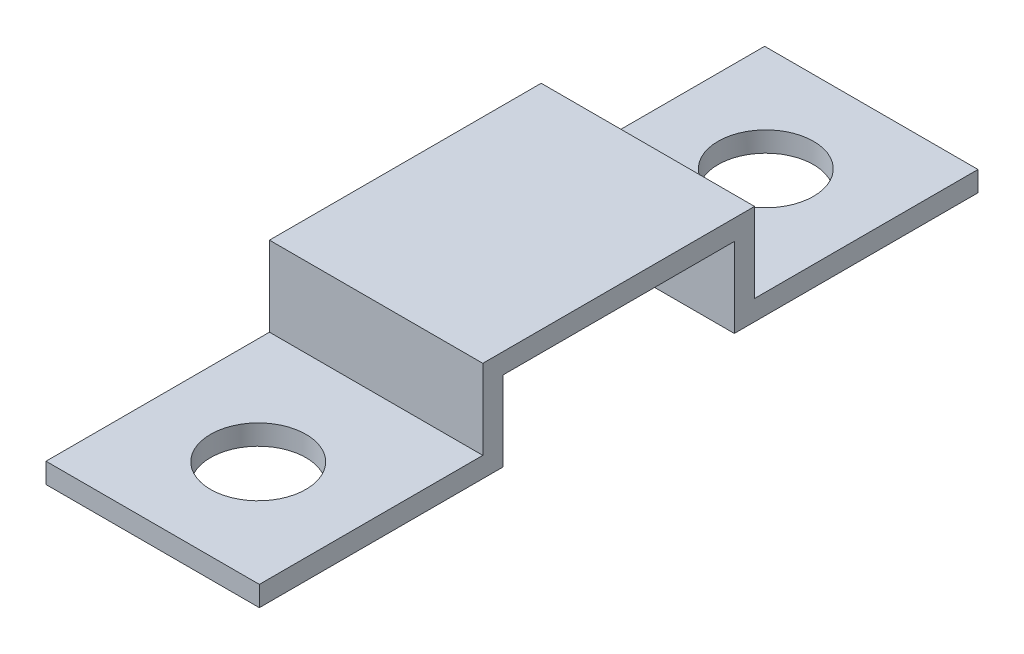
ISO-10303-21;
HEADER;
FILE_DESCRIPTION(('STEP AP214'),'2;1');
FILE_NAME('part.step','',(''),(''),'','','');
FILE_SCHEMA(('AUTOMOTIVE_DESIGN { 1 0 10303 214 1 1 1 1 }'));
ENDSEC;
DATA;
#1=APPLICATION_CONTEXT('core data for automotive mechanical design processes');
#2=APPLICATION_PROTOCOL_DEFINITION('international standard','automotive_design',2000,#1);
#3=PRODUCT_CONTEXT('',#1,'mechanical');
#4=PRODUCT('Part','Part','',(#3));
#5=PRODUCT_RELATED_PRODUCT_CATEGORY('part','',(#4));
#6=PRODUCT_DEFINITION_FORMATION('','',#4);
#7=PRODUCT_DEFINITION_CONTEXT('part definition',#1,'design');
#8=PRODUCT_DEFINITION('design','',#6,#7);
#9=PRODUCT_DEFINITION_SHAPE('','',#8);
#10=(LENGTH_UNIT() NAMED_UNIT(*) SI_UNIT(.MILLI.,.METRE.));
#11=(NAMED_UNIT(*) PLANE_ANGLE_UNIT() SI_UNIT($,.RADIAN.));
#12=(NAMED_UNIT(*) SI_UNIT($,.STERADIAN.) SOLID_ANGLE_UNIT());
#13=UNCERTAINTY_MEASURE_WITH_UNIT(LENGTH_MEASURE(1.E-05),#10,'distance_accuracy_value','');
#14=(GEOMETRIC_REPRESENTATION_CONTEXT(3) GLOBAL_UNCERTAINTY_ASSIGNED_CONTEXT((#13)) GLOBAL_UNIT_ASSIGNED_CONTEXT((#10,
#11,#12)) REPRESENTATION_CONTEXT('',''));
#15=CARTESIAN_POINT('',(0.,0.,0.));
#16=DIRECTION('',(0.,0.,1.));
#17=DIRECTION('',(1.,0.,0.));
#18=AXIS2_PLACEMENT_3D('',#15,#16,#17);
#19=CARTESIAN_POINT('',(19.,0.,12.1));
#20=DIRECTION('',(0.,0.,-1.));
#21=DIRECTION('',(0.,1.,0.));
#22=AXIS2_PLACEMENT_3D('',#19,#20,#21);
#23=PLANE('',#22);
#24=DIRECTION('',(0.,-1.,0.));
#25=VECTOR('',#24,1.);
#26=CARTESIAN_POINT('',(0.,0.,12.1));
#27=LINE('',#26,#25);
#28=CARTESIAN_POINT('',(0.,0.,12.1));
#29=VERTEX_POINT('',#28);
#30=CARTESIAN_POINT('',(0.,-7.1,12.1));
#31=VERTEX_POINT('',#30);
#32=EDGE_CURVE('E171',#29,#31,#27,.T.);
#33=ORIENTED_EDGE('',*,*,#32,.T.);
#34=DIRECTION('',(-1.,0.,0.));
#35=VECTOR('',#34,1.);
#36=CARTESIAN_POINT('',(19.,-7.1,12.1));
#37=LINE('',#36,#35);
#38=CARTESIAN_POINT('',(19.,-7.1,12.1));
#39=VERTEX_POINT('',#38);
#40=EDGE_CURVE('E11',#39,#31,#37,.T.);
#41=ORIENTED_EDGE('',*,*,#40,.F.);
#42=DIRECTION('',(0.,-1.,0.));
#43=VECTOR('',#42,1.);
#44=CARTESIAN_POINT('',(19.,0.,12.1));
#45=LINE('',#44,#43);
#46=CARTESIAN_POINT('',(19.,0.,12.1));
#47=VERTEX_POINT('',#46);
#48=EDGE_CURVE('E205',#47,#39,#45,.T.);
#49=ORIENTED_EDGE('',*,*,#48,.F.);
#50=DIRECTION('',(-1.,0.,0.));
#51=VECTOR('',#50,1.);
#52=CARTESIAN_POINT('',(19.,0.,12.1));
#53=LINE('',#52,#51);
#54=EDGE_CURVE('E167',#47,#29,#53,.T.);
#55=ORIENTED_EDGE('',*,*,#54,.T.);
#56=EDGE_LOOP('',(#33,#41,#49,#55));
#57=FACE_BOUND('',#56,.T.);
#58=ADVANCED_FACE('F45',(#57),#23,.F.);
#59=CARTESIAN_POINT('',(19.,-7.1,12.1));
#60=DIRECTION('',(0.,-1.,0.));
#61=DIRECTION('',(0.,0.,-1.));
#62=AXIS2_PLACEMENT_3D('',#59,#60,#61);
#63=PLANE('',#62);
#64=CARTESIAN_POINT('',(9.5,-7.1,22.6));
#65=DIRECTION('',(0.,1.,0.));
#66=DIRECTION('',(0.,0.,1.));
#67=AXIS2_PLACEMENT_3D('',#64,#65,#66);
#68=CIRCLE('',#67,4.25);
#69=CARTESIAN_POINT('',(9.5,-7.1,26.85));
#70=VERTEX_POINT('',#69);
#71=EDGE_CURVE('E340',#70,#70,#68,.T.);
#72=ORIENTED_EDGE('',*,*,#71,.F.);
#73=EDGE_LOOP('',(#72));
#74=FACE_BOUND('',#73,.T.);
#75=DIRECTION('',(0.,0.,1.));
#76=VECTOR('',#75,1.);
#77=CARTESIAN_POINT('',(0.,-7.1,12.1));
#78=LINE('',#77,#76);
#79=CARTESIAN_POINT('',(0.,-7.1,32.));
#80=VERTEX_POINT('',#79);
#81=EDGE_CURVE('E175',#31,#80,#78,.T.);
#82=ORIENTED_EDGE('',*,*,#81,.T.);
#83=DIRECTION('',(-1.,0.,0.));
#84=VECTOR('',#83,1.);
#85=CARTESIAN_POINT('',(19.,-7.1,32.));
#86=LINE('',#85,#84);
#87=CARTESIAN_POINT('',(19.,-7.1,32.));
#88=VERTEX_POINT('',#87);
#89=EDGE_CURVE('E55',#88,#80,#86,.T.);
#90=ORIENTED_EDGE('',*,*,#89,.F.);
#91=DIRECTION('',(0.,0.,1.));
#92=VECTOR('',#91,1.);
#93=CARTESIAN_POINT('',(19.,-7.1,12.1));
#94=LINE('',#93,#92);
#95=EDGE_CURVE('E118',#39,#88,#94,.T.);
#96=ORIENTED_EDGE('',*,*,#95,.F.);
#97=ORIENTED_EDGE('',*,*,#40,.T.);
#98=EDGE_LOOP('',(#82,#90,#96,#97));
#99=FACE_BOUND('',#98,.T.);
#100=ADVANCED_FACE('F300',(#74,#99),#63,.F.);
#101=CARTESIAN_POINT('',(19.,-7.1,32.));
#102=DIRECTION('',(0.,0.,-1.));
#103=DIRECTION('',(-1.,0.,0.));
#104=AXIS2_PLACEMENT_3D('',#101,#102,#103);
#105=PLANE('',#104);
#106=DIRECTION('',(0.,-1.,0.));
#107=VECTOR('',#106,1.);
#108=CARTESIAN_POINT('',(0.,-7.1,32.));
#109=LINE('',#108,#107);
#110=CARTESIAN_POINT('',(0.,-8.9,32.));
#111=VERTEX_POINT('',#110);
#112=EDGE_CURVE('E178',#80,#111,#109,.T.);
#113=ORIENTED_EDGE('',*,*,#112,.T.);
#114=DIRECTION('',(-1.,0.,0.));
#115=VECTOR('',#114,1.);
#116=CARTESIAN_POINT('',(19.,-8.9,32.));
#117=LINE('',#116,#115);
#118=CARTESIAN_POINT('',(19.,-8.9,32.));
#119=VERTEX_POINT('',#118);
#120=EDGE_CURVE('E232',#119,#111,#117,.T.);
#121=ORIENTED_EDGE('',*,*,#120,.F.);
#122=DIRECTION('',(0.,-1.,0.));
#123=VECTOR('',#122,1.);
#124=CARTESIAN_POINT('',(19.,-7.1,32.));
#125=LINE('',#124,#123);
#126=EDGE_CURVE('E243',#88,#119,#125,.T.);
#127=ORIENTED_EDGE('',*,*,#126,.F.);
#128=ORIENTED_EDGE('',*,*,#89,.T.);
#129=EDGE_LOOP('',(#113,#121,#127,#128));
#130=FACE_BOUND('',#129,.T.);
#131=ADVANCED_FACE('F241',(#130),#105,.F.);
#132=CARTESIAN_POINT('',(19.,-8.9,32.));
#133=DIRECTION('',(0.,1.,0.));
#134=DIRECTION('',(0.,0.,1.));
#135=AXIS2_PLACEMENT_3D('',#132,#133,#134);
#136=PLANE('',#135);
#137=CARTESIAN_POINT('',(9.5,-8.9,22.6));
#138=DIRECTION('',(0.,1.,0.));
#139=DIRECTION('',(0.,0.,1.));
#140=AXIS2_PLACEMENT_3D('',#137,#138,#139);
#141=CIRCLE('',#140,4.25);
#142=CARTESIAN_POINT('',(9.5,-8.9,26.85));
#143=VERTEX_POINT('',#142);
#144=EDGE_CURVE('E48',#143,#143,#141,.T.);
#145=ORIENTED_EDGE('',*,*,#144,.T.);
#146=EDGE_LOOP('',(#145));
#147=FACE_BOUND('',#146,.T.);
#148=DIRECTION('',(0.,0.,-1.));
#149=VECTOR('',#148,1.);
#150=CARTESIAN_POINT('',(0.,-8.9,32.));
#151=LINE('',#150,#149);
#152=CARTESIAN_POINT('',(0.,-8.9,10.3));
#153=VERTEX_POINT('',#152);
#154=EDGE_CURVE('E181',#111,#153,#151,.T.);
#155=ORIENTED_EDGE('',*,*,#154,.T.);
#156=DIRECTION('',(-1.,0.,0.));
#157=VECTOR('',#156,1.);
#158=CARTESIAN_POINT('',(19.,-8.9,10.3));
#159=LINE('',#158,#157);
#160=CARTESIAN_POINT('',(19.,-8.9,10.3));
#161=VERTEX_POINT('',#160);
#162=EDGE_CURVE('E228',#161,#153,#159,.T.);
#163=ORIENTED_EDGE('',*,*,#162,.F.);
#164=DIRECTION('',(0.,0.,-1.));
#165=VECTOR('',#164,1.);
#166=CARTESIAN_POINT('',(19.,-8.9,32.));
#167=LINE('',#166,#165);
#168=EDGE_CURVE('E262',#119,#161,#167,.T.);
#169=ORIENTED_EDGE('',*,*,#168,.F.);
#170=ORIENTED_EDGE('',*,*,#120,.T.);
#171=EDGE_LOOP('',(#155,#163,#169,#170));
#172=FACE_BOUND('',#171,.T.);
#173=ADVANCED_FACE('F252',(#147,#172),#136,.F.);
#174=CARTESIAN_POINT('',(19.,-8.9,10.3));
#175=DIRECTION('',(0.,0.,1.));
#176=DIRECTION('',(1.,0.,0.));
#177=AXIS2_PLACEMENT_3D('',#174,#175,#176);
#178=PLANE('',#177);
#179=DIRECTION('',(0.,1.,0.));
#180=VECTOR('',#179,1.);
#181=CARTESIAN_POINT('',(0.,-8.9,10.3));
#182=LINE('',#181,#180);
#183=CARTESIAN_POINT('',(0.,-1.8,10.3));
#184=VERTEX_POINT('',#183);
#185=EDGE_CURVE('E184',#153,#184,#182,.T.);
#186=ORIENTED_EDGE('',*,*,#185,.T.);
#187=DIRECTION('',(-1.,0.,0.));
#188=VECTOR('',#187,1.);
#189=CARTESIAN_POINT('',(19.,-1.8,10.3));
#190=LINE('',#189,#188);
#191=CARTESIAN_POINT('',(19.,-1.8,10.3));
#192=VERTEX_POINT('',#191);
#193=EDGE_CURVE('E224',#192,#184,#190,.T.);
#194=ORIENTED_EDGE('',*,*,#193,.F.);
#195=DIRECTION('',(0.,1.,0.));
#196=VECTOR('',#195,1.);
#197=CARTESIAN_POINT('',(19.,-8.9,10.3));
#198=LINE('',#197,#196);
#199=EDGE_CURVE('E258',#161,#192,#198,.T.);
#200=ORIENTED_EDGE('',*,*,#199,.F.);
#201=ORIENTED_EDGE('',*,*,#162,.T.);
#202=EDGE_LOOP('',(#186,#194,#200,#201));
#203=FACE_BOUND('',#202,.T.);
#204=ADVANCED_FACE('F256',(#203),#178,.F.);
#205=CARTESIAN_POINT('',(19.,-1.8,10.3));
#206=DIRECTION('',(0.,1.,0.));
#207=DIRECTION('',(0.,0.,1.));
#208=AXIS2_PLACEMENT_3D('',#205,#206,#207);
#209=PLANE('',#208);
#210=DIRECTION('',(0.,0.,-1.));
#211=VECTOR('',#210,1.);
#212=CARTESIAN_POINT('',(0.,-1.8,10.3));
#213=LINE('',#212,#211);
#214=CARTESIAN_POINT('',(0.,-1.8,-10.3));
#215=VERTEX_POINT('',#214);
#216=EDGE_CURVE('E187',#184,#215,#213,.T.);
#217=ORIENTED_EDGE('',*,*,#216,.T.);
#218=DIRECTION('',(-1.,0.,0.));
#219=VECTOR('',#218,1.);
#220=CARTESIAN_POINT('',(19.,-1.8,-10.3));
#221=LINE('',#220,#219);
#222=CARTESIAN_POINT('',(19.,-1.8,-10.3));
#223=VERTEX_POINT('',#222);
#224=EDGE_CURVE('E220',#223,#215,#221,.T.);
#225=ORIENTED_EDGE('',*,*,#224,.F.);
#226=DIRECTION('',(0.,0.,-1.));
#227=VECTOR('',#226,1.);
#228=CARTESIAN_POINT('',(19.,-1.8,10.3));
#229=LINE('',#228,#227);
#230=EDGE_CURVE('E261',#192,#223,#229,.T.);
#231=ORIENTED_EDGE('',*,*,#230,.F.);
#232=ORIENTED_EDGE('',*,*,#193,.T.);
#233=EDGE_LOOP('',(#217,#225,#231,#232));
#234=FACE_BOUND('',#233,.T.);
#235=ADVANCED_FACE('F317',(#234),#209,.F.);
#236=CARTESIAN_POINT('',(19.,-8.9,-10.3));
#237=DIRECTION('',(0.,0.,-1.));
#238=DIRECTION('',(-1.,0.,0.));
#239=AXIS2_PLACEMENT_3D('',#236,#237,#238);
#240=PLANE('',#239);
#241=DIRECTION('',(0.,-1.,0.));
#242=VECTOR('',#241,1.);
#243=CARTESIAN_POINT('',(0.,-8.9,-10.3));
#244=LINE('',#243,#242);
#245=CARTESIAN_POINT('',(0.,-8.9,-10.3));
#246=VERTEX_POINT('',#245);
#247=EDGE_CURVE('E190',#215,#246,#244,.T.);
#248=ORIENTED_EDGE('',*,*,#247,.T.);
#249=DIRECTION('',(-1.,0.,0.));
#250=VECTOR('',#249,1.);
#251=CARTESIAN_POINT('',(19.,-8.9,-10.3));
#252=LINE('',#251,#250);
#253=CARTESIAN_POINT('',(19.,-8.9,-10.3));
#254=VERTEX_POINT('',#253);
#255=EDGE_CURVE('E216',#254,#246,#252,.T.);
#256=ORIENTED_EDGE('',*,*,#255,.F.);
#257=DIRECTION('',(0.,-1.,0.));
#258=VECTOR('',#257,1.);
#259=CARTESIAN_POINT('',(19.,-8.9,-10.3));
#260=LINE('',#259,#258);
#261=EDGE_CURVE('E266',#223,#254,#260,.T.);
#262=ORIENTED_EDGE('',*,*,#261,.F.);
#263=ORIENTED_EDGE('',*,*,#224,.T.);
#264=EDGE_LOOP('',(#248,#256,#262,#263));
#265=FACE_BOUND('',#264,.T.);
#266=ADVANCED_FACE('F320',(#265),#240,.F.);
#267=CARTESIAN_POINT('',(19.,-8.9,-32.));
#268=DIRECTION('',(0.,1.,0.));
#269=DIRECTION('',(0.,0.,1.));
#270=AXIS2_PLACEMENT_3D('',#267,#268,#269);
#271=PLANE('',#270);
#272=CARTESIAN_POINT('',(9.5,-8.9,-22.6));
#273=DIRECTION('',(0.,1.,0.));
#274=DIRECTION('',(0.,0.,1.));
#275=AXIS2_PLACEMENT_3D('',#272,#273,#274);
#276=CIRCLE('',#275,4.25);
#277=CARTESIAN_POINT('',(9.5,-8.9,-18.35));
#278=VERTEX_POINT('',#277);
#279=EDGE_CURVE('E344',#278,#278,#276,.T.);
#280=ORIENTED_EDGE('',*,*,#279,.T.);
#281=EDGE_LOOP('',(#280));
#282=FACE_BOUND('',#281,.T.);
#283=DIRECTION('',(0.,0.,-1.));
#284=VECTOR('',#283,1.);
#285=CARTESIAN_POINT('',(0.,-8.9,-32.));
#286=LINE('',#285,#284);
#287=CARTESIAN_POINT('',(0.,-8.9,-32.));
#288=VERTEX_POINT('',#287);
#289=EDGE_CURVE('E193',#246,#288,#286,.T.);
#290=ORIENTED_EDGE('',*,*,#289,.T.);
#291=DIRECTION('',(-1.,0.,0.));
#292=VECTOR('',#291,1.);
#293=CARTESIAN_POINT('',(19.,-8.9,-32.));
#294=LINE('',#293,#292);
#295=CARTESIAN_POINT('',(19.,-8.9,-32.));
#296=VERTEX_POINT('',#295);
#297=EDGE_CURVE('E212',#296,#288,#294,.T.);
#298=ORIENTED_EDGE('',*,*,#297,.F.);
#299=DIRECTION('',(0.,0.,-1.));
#300=VECTOR('',#299,1.);
#301=CARTESIAN_POINT('',(19.,-8.9,-32.));
#302=LINE('',#301,#300);
#303=EDGE_CURVE('E273',#254,#296,#302,.T.);
#304=ORIENTED_EDGE('',*,*,#303,.F.);
#305=ORIENTED_EDGE('',*,*,#255,.T.);
#306=EDGE_LOOP('',(#290,#298,#304,#305));
#307=FACE_BOUND('',#306,.T.);
#308=ADVANCED_FACE('F281',(#282,#307),#271,.F.);
#309=CARTESIAN_POINT('',(19.,-7.1,-32.));
#310=DIRECTION('',(0.,0.,1.));
#311=DIRECTION('',(1.,0.,0.));
#312=AXIS2_PLACEMENT_3D('',#309,#310,#311);
#313=PLANE('',#312);
#314=DIRECTION('',(0.,1.,0.));
#315=VECTOR('',#314,1.);
#316=CARTESIAN_POINT('',(0.,-7.1,-32.));
#317=LINE('',#316,#315);
#318=CARTESIAN_POINT('',(0.,-7.1,-32.));
#319=VERTEX_POINT('',#318);
#320=EDGE_CURVE('E196',#288,#319,#317,.T.);
#321=ORIENTED_EDGE('',*,*,#320,.T.);
#322=DIRECTION('',(-1.,0.,0.));
#323=VECTOR('',#322,1.);
#324=CARTESIAN_POINT('',(19.,-7.1,-32.));
#325=LINE('',#324,#323);
#326=CARTESIAN_POINT('',(19.,-7.1,-32.));
#327=VERTEX_POINT('',#326);
#328=EDGE_CURVE('E160',#327,#319,#325,.T.);
#329=ORIENTED_EDGE('',*,*,#328,.F.);
#330=DIRECTION('',(0.,1.,0.));
#331=VECTOR('',#330,1.);
#332=CARTESIAN_POINT('',(19.,-7.1,-32.));
#333=LINE('',#332,#331);
#334=EDGE_CURVE('E149',#296,#327,#333,.T.);
#335=ORIENTED_EDGE('',*,*,#334,.F.);
#336=ORIENTED_EDGE('',*,*,#297,.T.);
#337=EDGE_LOOP('',(#321,#329,#335,#336));
#338=FACE_BOUND('',#337,.T.);
#339=ADVANCED_FACE('F285',(#338),#313,.F.);
#340=CARTESIAN_POINT('',(19.,-7.1,-12.1));
#341=DIRECTION('',(0.,-1.,0.));
#342=DIRECTION('',(0.,0.,-1.));
#343=AXIS2_PLACEMENT_3D('',#340,#341,#342);
#344=PLANE('',#343);
#345=CARTESIAN_POINT('',(9.5,-7.1,-22.6));
#346=DIRECTION('',(0.,1.,0.));
#347=DIRECTION('',(0.,0.,-1.));
#348=AXIS2_PLACEMENT_3D('',#345,#346,#347);
#349=CIRCLE('',#348,4.25);
#350=CARTESIAN_POINT('',(9.5,-7.1,-26.85));
#351=VERTEX_POINT('',#350);
#352=EDGE_CURVE('E337',#351,#351,#349,.T.);
#353=ORIENTED_EDGE('',*,*,#352,.F.);
#354=EDGE_LOOP('',(#353));
#355=FACE_BOUND('',#354,.T.);
#356=DIRECTION('',(0.,0.,1.));
#357=VECTOR('',#356,1.);
#358=CARTESIAN_POINT('',(0.,-7.1,-12.1));
#359=LINE('',#358,#357);
#360=CARTESIAN_POINT('',(0.,-7.1,-12.1));
#361=VERTEX_POINT('',#360);
#362=EDGE_CURVE('E158',#319,#361,#359,.T.);
#363=ORIENTED_EDGE('',*,*,#362,.T.);
#364=DIRECTION('',(-1.,0.,0.));
#365=VECTOR('',#364,1.);
#366=CARTESIAN_POINT('',(19.,-7.1,-12.1));
#367=LINE('',#366,#365);
#368=CARTESIAN_POINT('',(19.,-7.1,-12.1));
#369=VERTEX_POINT('',#368);
#370=EDGE_CURVE('E155',#369,#361,#367,.T.);
#371=ORIENTED_EDGE('',*,*,#370,.F.);
#372=DIRECTION('',(0.,0.,1.));
#373=VECTOR('',#372,1.);
#374=CARTESIAN_POINT('',(19.,-7.1,-12.1));
#375=LINE('',#374,#373);
#376=EDGE_CURVE('E143',#327,#369,#375,.T.);
#377=ORIENTED_EDGE('',*,*,#376,.F.);
#378=ORIENTED_EDGE('',*,*,#328,.T.);
#379=EDGE_LOOP('',(#363,#371,#377,#378));
#380=FACE_BOUND('',#379,.T.);
#381=ADVANCED_FACE('F156',(#355,#380),#344,.F.);
#382=CARTESIAN_POINT('',(19.,0.,-12.1));
#383=DIRECTION('',(0.,0.,1.));
#384=DIRECTION('',(0.,-1.,0.));
#385=AXIS2_PLACEMENT_3D('',#382,#383,#384);
#386=PLANE('',#385);
#387=DIRECTION('',(0.,1.,0.));
#388=VECTOR('',#387,1.);
#389=CARTESIAN_POINT('',(0.,0.,-12.1));
#390=LINE('',#389,#388);
#391=CARTESIAN_POINT('',(0.,0.,-12.1));
#392=VERTEX_POINT('',#391);
#393=EDGE_CURVE('E104',#361,#392,#390,.T.);
#394=ORIENTED_EDGE('',*,*,#393,.T.);
#395=DIRECTION('',(-1.,0.,0.));
#396=VECTOR('',#395,1.);
#397=CARTESIAN_POINT('',(19.,0.,-12.1));
#398=LINE('',#397,#396);
#399=CARTESIAN_POINT('',(19.,0.,-12.1));
#400=VERTEX_POINT('',#399);
#401=EDGE_CURVE('E161',#400,#392,#398,.T.);
#402=ORIENTED_EDGE('',*,*,#401,.F.);
#403=DIRECTION('',(0.,1.,0.));
#404=VECTOR('',#403,1.);
#405=CARTESIAN_POINT('',(19.,0.,-12.1));
#406=LINE('',#405,#404);
#407=EDGE_CURVE('E147',#369,#400,#406,.T.);
#408=ORIENTED_EDGE('',*,*,#407,.F.);
#409=ORIENTED_EDGE('',*,*,#370,.T.);
#410=EDGE_LOOP('',(#394,#402,#408,#409));
#411=FACE_BOUND('',#410,.T.);
#412=ADVANCED_FACE('F163',(#411),#386,.F.);
#413=CARTESIAN_POINT('',(19.,0.,-12.1));
#414=DIRECTION('',(0.,-1.,0.));
#415=DIRECTION('',(0.,0.,-1.));
#416=AXIS2_PLACEMENT_3D('',#413,#414,#415);
#417=PLANE('',#416);
#418=DIRECTION('',(0.,0.,1.));
#419=VECTOR('',#418,1.);
#420=CARTESIAN_POINT('',(0.,0.,-12.1));
#421=LINE('',#420,#419);
#422=EDGE_CURVE('E110',#392,#29,#421,.T.);
#423=ORIENTED_EDGE('',*,*,#422,.T.);
#424=ORIENTED_EDGE('',*,*,#54,.F.);
#425=DIRECTION('',(0.,0.,1.));
#426=VECTOR('',#425,1.);
#427=CARTESIAN_POINT('',(19.,0.,-12.1));
#428=LINE('',#427,#426);
#429=EDGE_CURVE('E63',#400,#47,#428,.T.);
#430=ORIENTED_EDGE('',*,*,#429,.F.);
#431=ORIENTED_EDGE('',*,*,#401,.T.);
#432=EDGE_LOOP('',(#423,#424,#430,#431));
#433=FACE_BOUND('',#432,.T.);
#434=ADVANCED_FACE('F289',(#433),#417,.F.);
#435=CARTESIAN_POINT('',(19.,0.,0.));
#436=DIRECTION('',(-1.,0.,0.));
#437=DIRECTION('',(0.,0.,1.));
#438=AXIS2_PLACEMENT_3D('',#435,#436,#437);
#439=PLANE('',#438);
#440=ORIENTED_EDGE('',*,*,#48,.T.);
#441=ORIENTED_EDGE('',*,*,#95,.T.);
#442=ORIENTED_EDGE('',*,*,#126,.T.);
#443=ORIENTED_EDGE('',*,*,#168,.T.);
#444=ORIENTED_EDGE('',*,*,#199,.T.);
#445=ORIENTED_EDGE('',*,*,#230,.T.);
#446=ORIENTED_EDGE('',*,*,#261,.T.);
#447=ORIENTED_EDGE('',*,*,#303,.T.);
#448=ORIENTED_EDGE('',*,*,#334,.T.);
#449=ORIENTED_EDGE('',*,*,#376,.T.);
#450=ORIENTED_EDGE('',*,*,#407,.T.);
#451=ORIENTED_EDGE('',*,*,#429,.T.);
#452=EDGE_LOOP('',(#440,#441,#442,#443,#444,#445,#446,#447,#448,#449,#450,#451));
#453=FACE_BOUND('',#452,.T.);
#454=ADVANCED_FACE('F145',(#453),#439,.F.);
#455=CARTESIAN_POINT('',(0.,0.,0.));
#456=DIRECTION('',(-1.,0.,0.));
#457=DIRECTION('',(0.,0.,1.));
#458=AXIS2_PLACEMENT_3D('',#455,#456,#457);
#459=PLANE('',#458);
#460=ORIENTED_EDGE('',*,*,#32,.F.);
#461=ORIENTED_EDGE('',*,*,#422,.F.);
#462=ORIENTED_EDGE('',*,*,#393,.F.);
#463=ORIENTED_EDGE('',*,*,#362,.F.);
#464=ORIENTED_EDGE('',*,*,#320,.F.);
#465=ORIENTED_EDGE('',*,*,#289,.F.);
#466=ORIENTED_EDGE('',*,*,#247,.F.);
#467=ORIENTED_EDGE('',*,*,#216,.F.);
#468=ORIENTED_EDGE('',*,*,#185,.F.);
#469=ORIENTED_EDGE('',*,*,#154,.F.);
#470=ORIENTED_EDGE('',*,*,#112,.F.);
#471=ORIENTED_EDGE('',*,*,#81,.F.);
#472=EDGE_LOOP('',(#460,#461,#462,#463,#464,#465,#466,#467,#468,#469,#470,#471));
#473=FACE_BOUND('',#472,.T.);
#474=ADVANCED_FACE('F247',(#473),#459,.T.);
#475=CARTESIAN_POINT('',(9.5,-26.1,-22.6));
#476=DIRECTION('',(0.,1.,0.));
#477=DIRECTION('',(0.,0.,1.));
#478=AXIS2_PLACEMENT_3D('',#475,#476,#477);
#479=CYLINDRICAL_SURFACE('',#478,4.25);
#480=ORIENTED_EDGE('',*,*,#352,.T.);
#481=EDGE_LOOP('',(#480));
#482=FACE_BOUND('',#481,.T.);
#483=ORIENTED_EDGE('',*,*,#279,.F.);
#484=EDGE_LOOP('',(#483));
#485=FACE_BOUND('',#484,.T.);
#486=ADVANCED_FACE('F360',(#482,#485),#479,.F.);
#487=CARTESIAN_POINT('',(9.5,-26.1,22.6));
#488=DIRECTION('',(0.,1.,0.));
#489=DIRECTION('',(0.,0.,1.));
#490=AXIS2_PLACEMENT_3D('',#487,#488,#489);
#491=CYLINDRICAL_SURFACE('',#490,4.25);
#492=ORIENTED_EDGE('',*,*,#71,.T.);
#493=EDGE_LOOP('',(#492));
#494=FACE_BOUND('',#493,.T.);
#495=ORIENTED_EDGE('',*,*,#144,.F.);
#496=EDGE_LOOP('',(#495));
#497=FACE_BOUND('',#496,.T.);
#498=ADVANCED_FACE('F358',(#494,#497),#491,.F.);
#499=CLOSED_SHELL('',(#58,#100,#131,#173,#204,#235,#266,#308,#339,#381,#412,#434,#454,#474,#486,#498));
#500=MANIFOLD_SOLID_BREP('B2',#499);
#501=ADVANCED_BREP_SHAPE_REPRESENTATION('',(#18,#500),#14);
#502=SHAPE_DEFINITION_REPRESENTATION(#9,#501);
ENDSEC;
END-ISO-10303-21;
